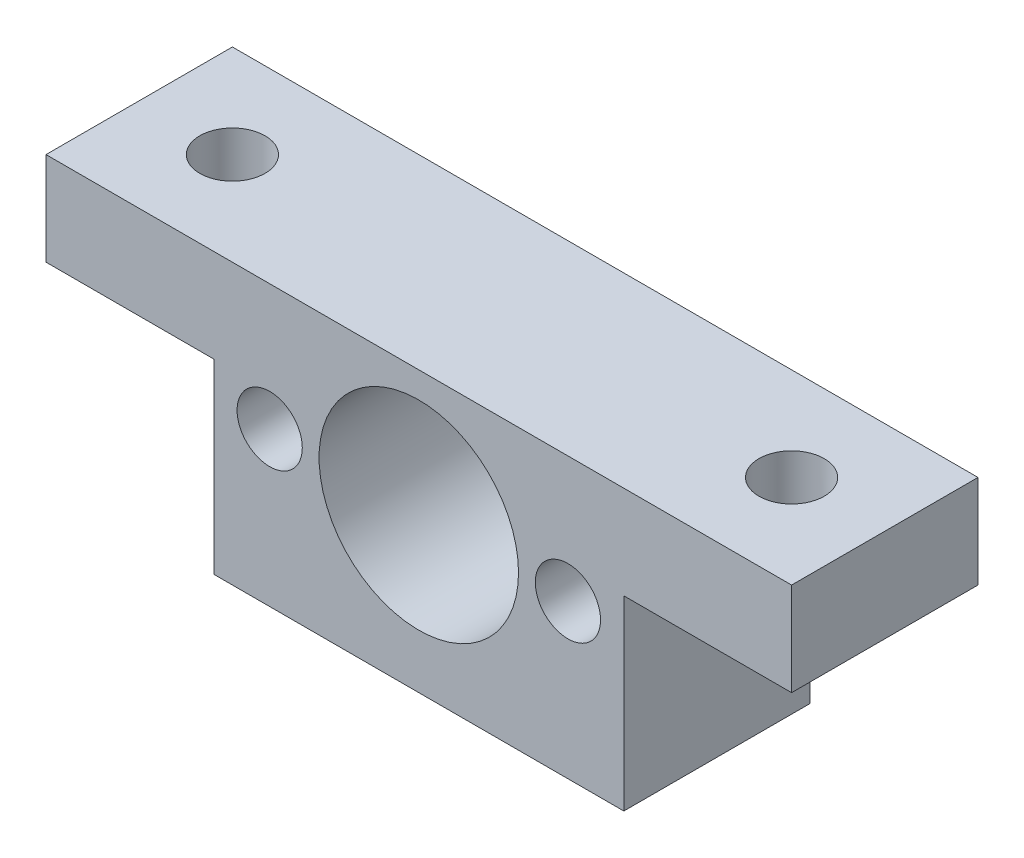
ISO-10303-21;
HEADER;
FILE_DESCRIPTION(('STEP AP214'),'2;1');
FILE_NAME('part.step','',(''),(''),'','','');
FILE_SCHEMA(('AUTOMOTIVE_DESIGN { 1 0 10303 214 1 1 1 1 }'));
ENDSEC;
DATA;
#1=APPLICATION_CONTEXT('core data for automotive mechanical design processes');
#2=APPLICATION_PROTOCOL_DEFINITION('international standard','automotive_design',2000,#1);
#3=PRODUCT_CONTEXT('',#1,'mechanical');
#4=PRODUCT('Part','Part','',(#3));
#5=PRODUCT_RELATED_PRODUCT_CATEGORY('part','',(#4));
#6=PRODUCT_DEFINITION_FORMATION('','',#4);
#7=PRODUCT_DEFINITION_CONTEXT('part definition',#1,'design');
#8=PRODUCT_DEFINITION('design','',#6,#7);
#9=PRODUCT_DEFINITION_SHAPE('','',#8);
#10=(LENGTH_UNIT() NAMED_UNIT(*) SI_UNIT(.MILLI.,.METRE.));
#11=(NAMED_UNIT(*) PLANE_ANGLE_UNIT() SI_UNIT($,.RADIAN.));
#12=(NAMED_UNIT(*) SI_UNIT($,.STERADIAN.) SOLID_ANGLE_UNIT());
#13=UNCERTAINTY_MEASURE_WITH_UNIT(LENGTH_MEASURE(1.E-05),#10,'distance_accuracy_value','');
#14=(GEOMETRIC_REPRESENTATION_CONTEXT(3) GLOBAL_UNCERTAINTY_ASSIGNED_CONTEXT((#13)) GLOBAL_UNIT_ASSIGNED_CONTEXT((#10,
#11,#12)) REPRESENTATION_CONTEXT('',''));
#15=CARTESIAN_POINT('',(0.,0.,0.));
#16=DIRECTION('',(0.,0.,1.));
#17=DIRECTION('',(1.,0.,0.));
#18=AXIS2_PLACEMENT_3D('',#15,#16,#17);
#19=CARTESIAN_POINT('',(0.,0.,10.));
#20=DIRECTION('',(0.,0.,1.));
#21=DIRECTION('',(1.,0.,0.));
#22=AXIS2_PLACEMENT_3D('',#19,#20,#21);
#23=PLANE('',#22);
#24=CARTESIAN_POINT('',(-8.,-6.74999999999999,10.));
#25=DIRECTION('',(0.,0.,1.));
#26=DIRECTION('',(1.,0.,0.));
#27=AXIS2_PLACEMENT_3D('',#24,#25,#26);
#28=CIRCLE('',#27,1.75);
#29=CARTESIAN_POINT('',(-6.25,-6.74999999999999,10.));
#30=VERTEX_POINT('',#29);
#31=EDGE_CURVE('E184',#30,#30,#28,.T.);
#32=ORIENTED_EDGE('',*,*,#31,.F.);
#33=EDGE_LOOP('',(#32));
#34=FACE_BOUND('',#33,.T.);
#35=DIRECTION('',(0.,1.,0.));
#36=VECTOR('',#35,1.);
#37=CARTESIAN_POINT('',(11.,-5.,10.));
#38=LINE('',#37,#36);
#39=CARTESIAN_POINT('',(11.,-15.,10.));
#40=VERTEX_POINT('',#39);
#41=CARTESIAN_POINT('',(11.,-5.,10.));
#42=VERTEX_POINT('',#41);
#43=EDGE_CURVE('E146',#40,#42,#38,.T.);
#44=ORIENTED_EDGE('',*,*,#43,.T.);
#45=DIRECTION('',(1.,0.,0.));
#46=VECTOR('',#45,1.);
#47=CARTESIAN_POINT('',(20.,-4.99999999999999,10.));
#48=LINE('',#47,#46);
#49=CARTESIAN_POINT('',(20.,-4.99999999999999,10.));
#50=VERTEX_POINT('',#49);
#51=EDGE_CURVE('E94',#42,#50,#48,.T.);
#52=ORIENTED_EDGE('',*,*,#51,.T.);
#53=DIRECTION('',(0.,1.,0.));
#54=VECTOR('',#53,1.);
#55=CARTESIAN_POINT('',(20.,0.,10.));
#56=LINE('',#55,#54);
#57=CARTESIAN_POINT('',(20.,0.,10.));
#58=VERTEX_POINT('',#57);
#59=EDGE_CURVE('E162',#50,#58,#56,.T.);
#60=ORIENTED_EDGE('',*,*,#59,.T.);
#61=DIRECTION('',(-1.,0.,0.));
#62=VECTOR('',#61,1.);
#63=CARTESIAN_POINT('',(-20.,0.,10.));
#64=LINE('',#63,#62);
#65=CARTESIAN_POINT('',(-20.,0.,10.));
#66=VERTEX_POINT('',#65);
#67=EDGE_CURVE('E175',#58,#66,#64,.T.);
#68=ORIENTED_EDGE('',*,*,#67,.T.);
#69=DIRECTION('',(0.,-1.,0.));
#70=VECTOR('',#69,1.);
#71=CARTESIAN_POINT('',(-20.,0.,10.));
#72=LINE('',#71,#70);
#73=CARTESIAN_POINT('',(-20.,-5.,10.));
#74=VERTEX_POINT('',#73);
#75=EDGE_CURVE('E113',#66,#74,#72,.T.);
#76=ORIENTED_EDGE('',*,*,#75,.T.);
#77=DIRECTION('',(1.,0.,0.));
#78=VECTOR('',#77,1.);
#79=CARTESIAN_POINT('',(-20.,-5.,10.));
#80=LINE('',#79,#78);
#81=CARTESIAN_POINT('',(-11.,-5.,10.));
#82=VERTEX_POINT('',#81);
#83=EDGE_CURVE('E107',#74,#82,#80,.T.);
#84=ORIENTED_EDGE('',*,*,#83,.T.);
#85=DIRECTION('',(0.,-1.,0.));
#86=VECTOR('',#85,1.);
#87=CARTESIAN_POINT('',(-11.,-5.,10.));
#88=LINE('',#87,#86);
#89=CARTESIAN_POINT('',(-11.,-15.,10.));
#90=VERTEX_POINT('',#89);
#91=EDGE_CURVE('E111',#82,#90,#88,.T.);
#92=ORIENTED_EDGE('',*,*,#91,.T.);
#93=DIRECTION('',(1.,0.,0.));
#94=VECTOR('',#93,1.);
#95=CARTESIAN_POINT('',(-11.,-15.,10.));
#96=LINE('',#95,#94);
#97=EDGE_CURVE('E51',#90,#40,#96,.T.);
#98=ORIENTED_EDGE('',*,*,#97,.T.);
#99=EDGE_LOOP('',(#44,#52,#60,#68,#76,#84,#92,#98));
#100=FACE_BOUND('',#99,.T.);
#101=CARTESIAN_POINT('',(0.,-6.74999999999999,10.));
#102=DIRECTION('',(0.,0.,1.));
#103=DIRECTION('',(1.,0.,0.));
#104=AXIS2_PLACEMENT_3D('',#101,#102,#103);
#105=CIRCLE('',#104,5.35);
#106=CARTESIAN_POINT('',(5.35,-6.74999999999999,10.));
#107=VERTEX_POINT('',#106);
#108=EDGE_CURVE('E135',#107,#107,#105,.T.);
#109=ORIENTED_EDGE('',*,*,#108,.F.);
#110=EDGE_LOOP('',(#109));
#111=FACE_BOUND('',#110,.T.);
#112=CARTESIAN_POINT('',(8.,-6.74999999999999,10.));
#113=DIRECTION('',(0.,0.,1.));
#114=DIRECTION('',(1.,0.,0.));
#115=AXIS2_PLACEMENT_3D('',#112,#113,#114);
#116=CIRCLE('',#115,1.75);
#117=CARTESIAN_POINT('',(9.75,-6.74999999999999,10.));
#118=VERTEX_POINT('',#117);
#119=EDGE_CURVE('E190',#118,#118,#116,.T.);
#120=ORIENTED_EDGE('',*,*,#119,.F.);
#121=EDGE_LOOP('',(#120));
#122=FACE_BOUND('',#121,.T.);
#123=ADVANCED_FACE('F33',(#34,#100,#111,#122),#23,.T.);
#124=CARTESIAN_POINT('',(0.,0.,0.));
#125=DIRECTION('',(0.,0.,1.));
#126=DIRECTION('',(1.,0.,0.));
#127=AXIS2_PLACEMENT_3D('',#124,#125,#126);
#128=PLANE('',#127);
#129=DIRECTION('',(0.,1.,0.));
#130=VECTOR('',#129,1.);
#131=CARTESIAN_POINT('',(11.,-5.,0.));
#132=LINE('',#131,#130);
#133=CARTESIAN_POINT('',(11.,-15.,0.));
#134=VERTEX_POINT('',#133);
#135=CARTESIAN_POINT('',(11.,-5.,0.));
#136=VERTEX_POINT('',#135);
#137=EDGE_CURVE('E131',#134,#136,#132,.T.);
#138=ORIENTED_EDGE('',*,*,#137,.F.);
#139=DIRECTION('',(1.,0.,0.));
#140=VECTOR('',#139,1.);
#141=CARTESIAN_POINT('',(-11.,-15.,0.));
#142=LINE('',#141,#140);
#143=CARTESIAN_POINT('',(-11.,-15.,0.));
#144=VERTEX_POINT('',#143);
#145=EDGE_CURVE('E86',#144,#134,#142,.T.);
#146=ORIENTED_EDGE('',*,*,#145,.F.);
#147=DIRECTION('',(0.,-1.,0.));
#148=VECTOR('',#147,1.);
#149=CARTESIAN_POINT('',(-11.,-5.,0.));
#150=LINE('',#149,#148);
#151=CARTESIAN_POINT('',(-11.,-5.,0.));
#152=VERTEX_POINT('',#151);
#153=EDGE_CURVE('E80',#152,#144,#150,.T.);
#154=ORIENTED_EDGE('',*,*,#153,.F.);
#155=DIRECTION('',(1.,0.,0.));
#156=VECTOR('',#155,1.);
#157=CARTESIAN_POINT('',(-20.,-5.,0.));
#158=LINE('',#157,#156);
#159=CARTESIAN_POINT('',(-20.,-5.,0.));
#160=VERTEX_POINT('',#159);
#161=EDGE_CURVE('E121',#160,#152,#158,.T.);
#162=ORIENTED_EDGE('',*,*,#161,.F.);
#163=DIRECTION('',(0.,-1.,0.));
#164=VECTOR('',#163,1.);
#165=CARTESIAN_POINT('',(-20.,0.,0.));
#166=LINE('',#165,#164);
#167=CARTESIAN_POINT('',(-20.,0.,0.));
#168=VERTEX_POINT('',#167);
#169=EDGE_CURVE('E141',#168,#160,#166,.T.);
#170=ORIENTED_EDGE('',*,*,#169,.F.);
#171=DIRECTION('',(-1.,0.,0.));
#172=VECTOR('',#171,1.);
#173=CARTESIAN_POINT('',(-20.,0.,0.));
#174=LINE('',#173,#172);
#175=CARTESIAN_POINT('',(20.,0.,0.));
#176=VERTEX_POINT('',#175);
#177=EDGE_CURVE('E139',#176,#168,#174,.T.);
#178=ORIENTED_EDGE('',*,*,#177,.F.);
#179=DIRECTION('',(0.,1.,0.));
#180=VECTOR('',#179,1.);
#181=CARTESIAN_POINT('',(20.,0.,0.));
#182=LINE('',#181,#180);
#183=CARTESIAN_POINT('',(20.,-4.99999999999999,0.));
#184=VERTEX_POINT('',#183);
#185=EDGE_CURVE('E137',#184,#176,#182,.T.);
#186=ORIENTED_EDGE('',*,*,#185,.F.);
#187=DIRECTION('',(1.,0.,0.));
#188=VECTOR('',#187,1.);
#189=CARTESIAN_POINT('',(20.,-4.99999999999999,0.));
#190=LINE('',#189,#188);
#191=EDGE_CURVE('E134',#136,#184,#190,.T.);
#192=ORIENTED_EDGE('',*,*,#191,.F.);
#193=EDGE_LOOP('',(#138,#146,#154,#162,#170,#178,#186,#192));
#194=FACE_BOUND('',#193,.T.);
#195=CARTESIAN_POINT('',(0.,-6.74999999999999,0.));
#196=DIRECTION('',(0.,0.,1.));
#197=DIRECTION('',(1.,0.,0.));
#198=AXIS2_PLACEMENT_3D('',#195,#196,#197);
#199=CIRCLE('',#198,5.35);
#200=CARTESIAN_POINT('',(5.35,-6.74999999999999,0.));
#201=VERTEX_POINT('',#200);
#202=EDGE_CURVE('E181',#201,#201,#199,.T.);
#203=ORIENTED_EDGE('',*,*,#202,.T.);
#204=EDGE_LOOP('',(#203));
#205=FACE_BOUND('',#204,.T.);
#206=CARTESIAN_POINT('',(-8.,-6.74999999999999,0.));
#207=DIRECTION('',(0.,0.,1.));
#208=DIRECTION('',(1.,0.,0.));
#209=AXIS2_PLACEMENT_3D('',#206,#207,#208);
#210=CIRCLE('',#209,1.75);
#211=CARTESIAN_POINT('',(-6.25,-6.74999999999999,0.));
#212=VERTEX_POINT('',#211);
#213=EDGE_CURVE('E187',#212,#212,#210,.T.);
#214=ORIENTED_EDGE('',*,*,#213,.T.);
#215=EDGE_LOOP('',(#214));
#216=FACE_BOUND('',#215,.T.);
#217=CARTESIAN_POINT('',(8.,-6.74999999999999,0.));
#218=DIRECTION('',(0.,0.,1.));
#219=DIRECTION('',(1.,0.,0.));
#220=AXIS2_PLACEMENT_3D('',#217,#218,#219);
#221=CIRCLE('',#220,1.75);
#222=CARTESIAN_POINT('',(9.75,-6.74999999999999,0.));
#223=VERTEX_POINT('',#222);
#224=EDGE_CURVE('E193',#223,#223,#221,.T.);
#225=ORIENTED_EDGE('',*,*,#224,.T.);
#226=EDGE_LOOP('',(#225));
#227=FACE_BOUND('',#226,.T.);
#228=ADVANCED_FACE('F166',(#194,#205,#216,#227),#128,.F.);
#229=CARTESIAN_POINT('',(11.,-5.,10.));
#230=DIRECTION('',(-1.,0.,0.));
#231=DIRECTION('',(0.,-1.,0.));
#232=AXIS2_PLACEMENT_3D('',#229,#230,#231);
#233=PLANE('',#232);
#234=ORIENTED_EDGE('',*,*,#137,.T.);
#235=DIRECTION('',(0.,0.,-1.));
#236=VECTOR('',#235,1.);
#237=CARTESIAN_POINT('',(11.,-5.,10.));
#238=LINE('',#237,#236);
#239=EDGE_CURVE('E11',#42,#136,#238,.T.);
#240=ORIENTED_EDGE('',*,*,#239,.F.);
#241=ORIENTED_EDGE('',*,*,#43,.F.);
#242=DIRECTION('',(0.,0.,-1.));
#243=VECTOR('',#242,1.);
#244=CARTESIAN_POINT('',(11.,-15.,10.));
#245=LINE('',#244,#243);
#246=EDGE_CURVE('E127',#40,#134,#245,.T.);
#247=ORIENTED_EDGE('',*,*,#246,.T.);
#248=EDGE_LOOP('',(#234,#240,#241,#247));
#249=FACE_BOUND('',#248,.T.);
#250=ADVANCED_FACE('F35',(#249),#233,.F.);
#251=CARTESIAN_POINT('',(20.,-4.99999999999999,10.));
#252=DIRECTION('',(0.,1.,0.));
#253=DIRECTION('',(-1.,0.,0.));
#254=AXIS2_PLACEMENT_3D('',#251,#252,#253);
#255=PLANE('',#254);
#256=CARTESIAN_POINT('',(15.,-5.,5.));
#257=DIRECTION('',(0.,1.,0.));
#258=DIRECTION('',(-1.,0.,0.));
#259=AXIS2_PLACEMENT_3D('',#256,#257,#258);
#260=CIRCLE('',#259,1.75);
#261=CARTESIAN_POINT('',(13.25,-5.,5.));
#262=VERTEX_POINT('',#261);
#263=EDGE_CURVE('E201',#262,#262,#260,.T.);
#264=ORIENTED_EDGE('',*,*,#263,.T.);
#265=EDGE_LOOP('',(#264));
#266=FACE_BOUND('',#265,.T.);
#267=ORIENTED_EDGE('',*,*,#191,.T.);
#268=DIRECTION('',(0.,0.,-1.));
#269=VECTOR('',#268,1.);
#270=CARTESIAN_POINT('',(20.,-4.99999999999999,10.));
#271=LINE('',#270,#269);
#272=EDGE_CURVE('E43',#50,#184,#271,.T.);
#273=ORIENTED_EDGE('',*,*,#272,.F.);
#274=ORIENTED_EDGE('',*,*,#51,.F.);
#275=ORIENTED_EDGE('',*,*,#239,.T.);
#276=EDGE_LOOP('',(#267,#273,#274,#275));
#277=FACE_BOUND('',#276,.T.);
#278=ADVANCED_FACE('F296',(#266,#277),#255,.F.);
#279=CARTESIAN_POINT('',(20.,0.,10.));
#280=DIRECTION('',(-1.,0.,0.));
#281=DIRECTION('',(0.,0.,1.));
#282=AXIS2_PLACEMENT_3D('',#279,#280,#281);
#283=PLANE('',#282);
#284=ORIENTED_EDGE('',*,*,#185,.T.);
#285=DIRECTION('',(0.,0.,-1.));
#286=VECTOR('',#285,1.);
#287=CARTESIAN_POINT('',(20.,0.,10.));
#288=LINE('',#287,#286);
#289=EDGE_CURVE('E153',#58,#176,#288,.T.);
#290=ORIENTED_EDGE('',*,*,#289,.F.);
#291=ORIENTED_EDGE('',*,*,#59,.F.);
#292=ORIENTED_EDGE('',*,*,#272,.T.);
#293=EDGE_LOOP('',(#284,#290,#291,#292));
#294=FACE_BOUND('',#293,.T.);
#295=ADVANCED_FACE('F160',(#294),#283,.F.);
#296=CARTESIAN_POINT('',(-20.,0.,10.));
#297=DIRECTION('',(0.,-1.,0.));
#298=DIRECTION('',(1.,0.,0.));
#299=AXIS2_PLACEMENT_3D('',#296,#297,#298);
#300=PLANE('',#299);
#301=CARTESIAN_POINT('',(15.,0.,5.));
#302=DIRECTION('',(0.,1.,0.));
#303=DIRECTION('',(1.,0.,0.));
#304=AXIS2_PLACEMENT_3D('',#301,#302,#303);
#305=CIRCLE('',#304,1.75);
#306=CARTESIAN_POINT('',(16.75,0.,5.));
#307=VERTEX_POINT('',#306);
#308=EDGE_CURVE('E204',#307,#307,#305,.T.);
#309=ORIENTED_EDGE('',*,*,#308,.F.);
#310=EDGE_LOOP('',(#309));
#311=FACE_BOUND('',#310,.T.);
#312=CARTESIAN_POINT('',(-15.,0.,5.));
#313=DIRECTION('',(0.,1.,0.));
#314=DIRECTION('',(-1.,0.,0.));
#315=AXIS2_PLACEMENT_3D('',#312,#313,#314);
#316=CIRCLE('',#315,1.75);
#317=CARTESIAN_POINT('',(-16.75,0.,5.));
#318=VERTEX_POINT('',#317);
#319=EDGE_CURVE('E198',#318,#318,#316,.T.);
#320=ORIENTED_EDGE('',*,*,#319,.F.);
#321=EDGE_LOOP('',(#320));
#322=FACE_BOUND('',#321,.T.);
#323=ORIENTED_EDGE('',*,*,#177,.T.);
#324=DIRECTION('',(0.,0.,-1.));
#325=VECTOR('',#324,1.);
#326=CARTESIAN_POINT('',(-20.,0.,10.));
#327=LINE('',#326,#325);
#328=EDGE_CURVE('E150',#66,#168,#327,.T.);
#329=ORIENTED_EDGE('',*,*,#328,.F.);
#330=ORIENTED_EDGE('',*,*,#67,.F.);
#331=ORIENTED_EDGE('',*,*,#289,.T.);
#332=EDGE_LOOP('',(#323,#329,#330,#331));
#333=FACE_BOUND('',#332,.T.);
#334=ADVANCED_FACE('F171',(#311,#322,#333),#300,.F.);
#335=CARTESIAN_POINT('',(-20.,0.,10.));
#336=DIRECTION('',(1.,0.,0.));
#337=DIRECTION('',(0.,0.,-1.));
#338=AXIS2_PLACEMENT_3D('',#335,#336,#337);
#339=PLANE('',#338);
#340=ORIENTED_EDGE('',*,*,#169,.T.);
#341=DIRECTION('',(0.,0.,-1.));
#342=VECTOR('',#341,1.);
#343=CARTESIAN_POINT('',(-20.,-5.,10.));
#344=LINE('',#343,#342);
#345=EDGE_CURVE('E122',#74,#160,#344,.T.);
#346=ORIENTED_EDGE('',*,*,#345,.F.);
#347=ORIENTED_EDGE('',*,*,#75,.F.);
#348=ORIENTED_EDGE('',*,*,#328,.T.);
#349=EDGE_LOOP('',(#340,#346,#347,#348));
#350=FACE_BOUND('',#349,.T.);
#351=ADVANCED_FACE('F174',(#350),#339,.F.);
#352=CARTESIAN_POINT('',(-20.,-5.,10.));
#353=DIRECTION('',(0.,1.,0.));
#354=DIRECTION('',(0.,0.,1.));
#355=AXIS2_PLACEMENT_3D('',#352,#353,#354);
#356=PLANE('',#355);
#357=CARTESIAN_POINT('',(-15.,-5.,5.));
#358=DIRECTION('',(0.,1.,0.));
#359=DIRECTION('',(0.,0.,1.));
#360=AXIS2_PLACEMENT_3D('',#357,#358,#359);
#361=CIRCLE('',#360,1.75);
#362=CARTESIAN_POINT('',(-15.,-5.,6.75));
#363=VERTEX_POINT('',#362);
#364=EDGE_CURVE('E37',#363,#363,#361,.T.);
#365=ORIENTED_EDGE('',*,*,#364,.T.);
#366=EDGE_LOOP('',(#365));
#367=FACE_BOUND('',#366,.T.);
#368=ORIENTED_EDGE('',*,*,#161,.T.);
#369=DIRECTION('',(0.,0.,-1.));
#370=VECTOR('',#369,1.);
#371=CARTESIAN_POINT('',(-11.,-5.,10.));
#372=LINE('',#371,#370);
#373=EDGE_CURVE('E118',#82,#152,#372,.T.);
#374=ORIENTED_EDGE('',*,*,#373,.F.);
#375=ORIENTED_EDGE('',*,*,#83,.F.);
#376=ORIENTED_EDGE('',*,*,#345,.T.);
#377=EDGE_LOOP('',(#368,#374,#375,#376));
#378=FACE_BOUND('',#377,.T.);
#379=ADVANCED_FACE('F119',(#367,#378),#356,.F.);
#380=CARTESIAN_POINT('',(-11.,-5.,10.));
#381=DIRECTION('',(1.,0.,0.));
#382=DIRECTION('',(0.,1.,0.));
#383=AXIS2_PLACEMENT_3D('',#380,#381,#382);
#384=PLANE('',#383);
#385=ORIENTED_EDGE('',*,*,#153,.T.);
#386=DIRECTION('',(0.,0.,-1.));
#387=VECTOR('',#386,1.);
#388=CARTESIAN_POINT('',(-11.,-15.,10.));
#389=LINE('',#388,#387);
#390=EDGE_CURVE('E123',#90,#144,#389,.T.);
#391=ORIENTED_EDGE('',*,*,#390,.F.);
#392=ORIENTED_EDGE('',*,*,#91,.F.);
#393=ORIENTED_EDGE('',*,*,#373,.T.);
#394=EDGE_LOOP('',(#385,#391,#392,#393));
#395=FACE_BOUND('',#394,.T.);
#396=ADVANCED_FACE('F125',(#395),#384,.F.);
#397=CARTESIAN_POINT('',(-11.,-15.,10.));
#398=DIRECTION('',(0.,1.,0.));
#399=DIRECTION('',(-1.,0.,0.));
#400=AXIS2_PLACEMENT_3D('',#397,#398,#399);
#401=PLANE('',#400);
#402=ORIENTED_EDGE('',*,*,#145,.T.);
#403=ORIENTED_EDGE('',*,*,#246,.F.);
#404=ORIENTED_EDGE('',*,*,#97,.F.);
#405=ORIENTED_EDGE('',*,*,#390,.T.);
#406=EDGE_LOOP('',(#402,#403,#404,#405));
#407=FACE_BOUND('',#406,.T.);
#408=ADVANCED_FACE('F230',(#407),#401,.F.);
#409=CARTESIAN_POINT('',(0.,-6.74999999999999,10.));
#410=DIRECTION('',(0.,0.,-1.));
#411=DIRECTION('',(-1.,0.,0.));
#412=AXIS2_PLACEMENT_3D('',#409,#410,#411);
#413=CYLINDRICAL_SURFACE('',#412,5.35);
#414=ORIENTED_EDGE('',*,*,#108,.T.);
#415=EDGE_LOOP('',(#414));
#416=FACE_BOUND('',#415,.T.);
#417=ORIENTED_EDGE('',*,*,#202,.F.);
#418=EDGE_LOOP('',(#417));
#419=FACE_BOUND('',#418,.T.);
#420=ADVANCED_FACE('F242',(#416,#419),#413,.F.);
#421=CARTESIAN_POINT('',(-8.,-6.74999999999999,10.));
#422=DIRECTION('',(0.,0.,-1.));
#423=DIRECTION('',(-1.,0.,0.));
#424=AXIS2_PLACEMENT_3D('',#421,#422,#423);
#425=CYLINDRICAL_SURFACE('',#424,1.75);
#426=ORIENTED_EDGE('',*,*,#31,.T.);
#427=EDGE_LOOP('',(#426));
#428=FACE_BOUND('',#427,.T.);
#429=ORIENTED_EDGE('',*,*,#213,.F.);
#430=EDGE_LOOP('',(#429));
#431=FACE_BOUND('',#430,.T.);
#432=ADVANCED_FACE('F249',(#428,#431),#425,.F.);
#433=CARTESIAN_POINT('',(8.,-6.74999999999999,10.));
#434=DIRECTION('',(0.,0.,-1.));
#435=DIRECTION('',(-1.,0.,0.));
#436=AXIS2_PLACEMENT_3D('',#433,#434,#435);
#437=CYLINDRICAL_SURFACE('',#436,1.75);
#438=ORIENTED_EDGE('',*,*,#119,.T.);
#439=EDGE_LOOP('',(#438));
#440=FACE_BOUND('',#439,.T.);
#441=ORIENTED_EDGE('',*,*,#224,.F.);
#442=EDGE_LOOP('',(#441));
#443=FACE_BOUND('',#442,.T.);
#444=ADVANCED_FACE('F219',(#440,#443),#437,.F.);
#445=CARTESIAN_POINT('',(-15.,-10.,5.));
#446=DIRECTION('',(0.,1.,0.));
#447=DIRECTION('',(-1.,0.,0.));
#448=AXIS2_PLACEMENT_3D('',#445,#446,#447);
#449=CYLINDRICAL_SURFACE('',#448,1.75);
#450=ORIENTED_EDGE('',*,*,#319,.T.);
#451=EDGE_LOOP('',(#450));
#452=FACE_BOUND('',#451,.T.);
#453=ORIENTED_EDGE('',*,*,#364,.F.);
#454=EDGE_LOOP('',(#453));
#455=FACE_BOUND('',#454,.T.);
#456=ADVANCED_FACE('F216',(#452,#455),#449,.F.);
#457=CARTESIAN_POINT('',(15.,-10.,5.));
#458=DIRECTION('',(0.,1.,0.));
#459=DIRECTION('',(-1.,0.,0.));
#460=AXIS2_PLACEMENT_3D('',#457,#458,#459);
#461=CYLINDRICAL_SURFACE('',#460,1.75);
#462=ORIENTED_EDGE('',*,*,#308,.T.);
#463=EDGE_LOOP('',(#462));
#464=FACE_BOUND('',#463,.T.);
#465=ORIENTED_EDGE('',*,*,#263,.F.);
#466=EDGE_LOOP('',(#465));
#467=FACE_BOUND('',#466,.T.);
#468=ADVANCED_FACE('F208',(#464,#467),#461,.F.);
#469=CLOSED_SHELL('',(#123,#228,#250,#278,#295,#334,#351,#379,#396,#408,#420,#432,#444,#456,#468));
#470=MANIFOLD_SOLID_BREP('B2',#469);
#471=ADVANCED_BREP_SHAPE_REPRESENTATION('',(#18,#470),#14);
#472=SHAPE_DEFINITION_REPRESENTATION(#9,#471);
ENDSEC;
END-ISO-10303-21;
